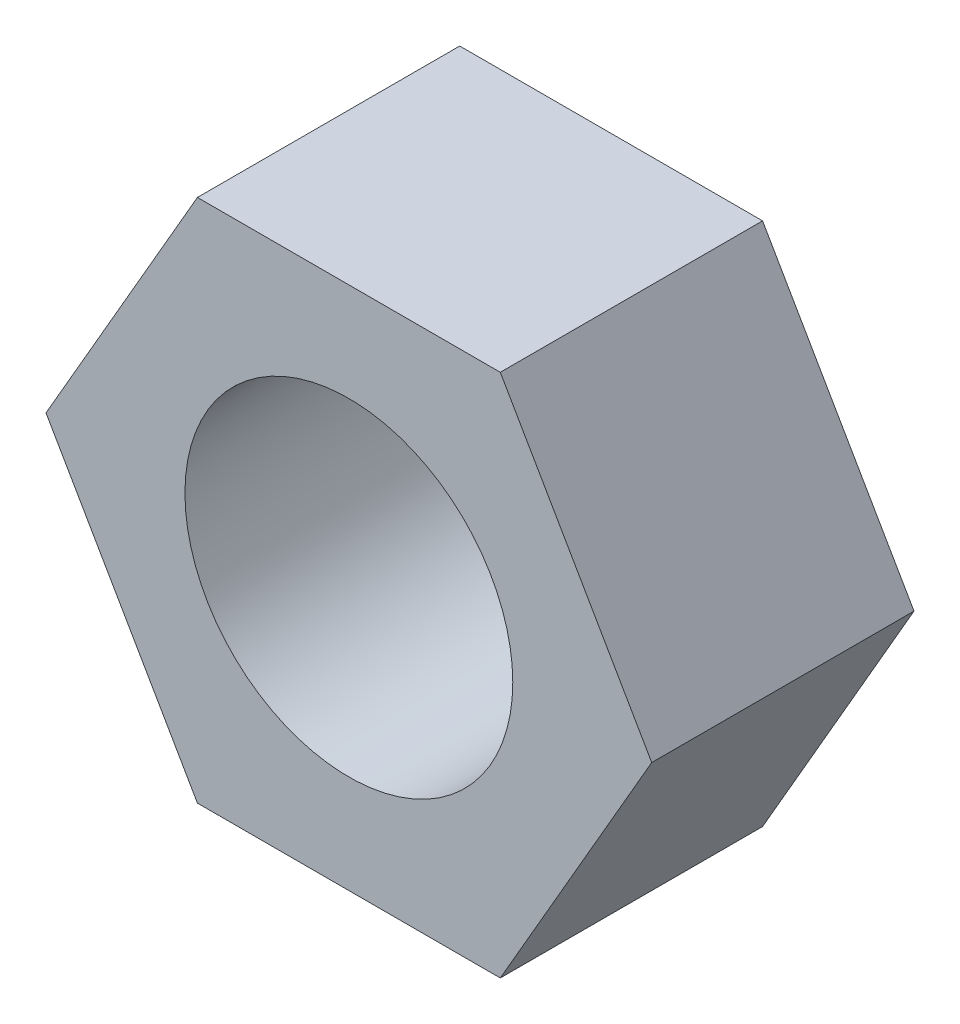
ISO-10303-21;
HEADER;
FILE_DESCRIPTION(('STEP AP214'),'2;1');
FILE_NAME('part.step','',(''),(''),'','','');
FILE_SCHEMA(('AUTOMOTIVE_DESIGN { 1 0 10303 214 1 1 1 1 }'));
ENDSEC;
DATA;
#1=APPLICATION_CONTEXT('core data for automotive mechanical design processes');
#2=APPLICATION_PROTOCOL_DEFINITION('international standard','automotive_design',2000,#1);
#3=PRODUCT_CONTEXT('',#1,'mechanical');
#4=PRODUCT('Part','Part','',(#3));
#5=PRODUCT_RELATED_PRODUCT_CATEGORY('part','',(#4));
#6=PRODUCT_DEFINITION_FORMATION('','',#4);
#7=PRODUCT_DEFINITION_CONTEXT('part definition',#1,'design');
#8=PRODUCT_DEFINITION('design','',#6,#7);
#9=PRODUCT_DEFINITION_SHAPE('','',#8);
#10=(LENGTH_UNIT() NAMED_UNIT(*) SI_UNIT(.MILLI.,.METRE.));
#11=(NAMED_UNIT(*) PLANE_ANGLE_UNIT() SI_UNIT($,.RADIAN.));
#12=(NAMED_UNIT(*) SI_UNIT($,.STERADIAN.) SOLID_ANGLE_UNIT());
#13=UNCERTAINTY_MEASURE_WITH_UNIT(LENGTH_MEASURE(1.E-05),#10,'distance_accuracy_value','');
#14=(GEOMETRIC_REPRESENTATION_CONTEXT(3) GLOBAL_UNCERTAINTY_ASSIGNED_CONTEXT((#13)) GLOBAL_UNIT_ASSIGNED_CONTEXT((#10,
#11,#12)) REPRESENTATION_CONTEXT('',''));
#15=CARTESIAN_POINT('',(0.,0.,0.));
#16=DIRECTION('',(0.,0.,1.));
#17=DIRECTION('',(1.,0.,0.));
#18=AXIS2_PLACEMENT_3D('',#15,#16,#17);
#19=CARTESIAN_POINT('',(0.,0.,4.));
#20=DIRECTION('',(0.,0.,1.));
#21=DIRECTION('',(1.,0.,0.));
#22=AXIS2_PLACEMENT_3D('',#19,#20,#21);
#23=PLANE('',#22);
#24=DIRECTION('',(0.5,0.866025403784439,0.));
#25=VECTOR('',#24,1.);
#26=CARTESIAN_POINT('',(2.3094010767585,-4.,4.));
#27=LINE('',#26,#25);
#28=CARTESIAN_POINT('',(2.3094010767585,-4.,4.));
#29=VERTEX_POINT('',#28);
#30=CARTESIAN_POINT('',(4.61880215351701,0.,4.));
#31=VERTEX_POINT('',#30);
#32=EDGE_CURVE('E130',#29,#31,#27,.T.);
#33=ORIENTED_EDGE('',*,*,#32,.T.);
#34=DIRECTION('',(-0.5,0.866025403784438,0.));
#35=VECTOR('',#34,1.);
#36=CARTESIAN_POINT('',(4.61880215351701,0.,4.));
#37=LINE('',#36,#35);
#38=CARTESIAN_POINT('',(2.3094010767585,4.00000000000001,4.));
#39=VERTEX_POINT('',#38);
#40=EDGE_CURVE('E88',#31,#39,#37,.T.);
#41=ORIENTED_EDGE('',*,*,#40,.T.);
#42=DIRECTION('',(-1.,0.,0.));
#43=VECTOR('',#42,1.);
#44=CARTESIAN_POINT('',(2.3094010767585,4.00000000000001,4.));
#45=LINE('',#44,#43);
#46=CARTESIAN_POINT('',(-2.30940107675851,4.00000000000001,4.));
#47=VERTEX_POINT('',#46);
#48=EDGE_CURVE('E101',#39,#47,#45,.T.);
#49=ORIENTED_EDGE('',*,*,#48,.T.);
#50=DIRECTION('',(-0.5,-0.866025403784439,0.));
#51=VECTOR('',#50,1.);
#52=CARTESIAN_POINT('',(-2.30940107675851,4.00000000000001,4.));
#53=LINE('',#52,#51);
#54=CARTESIAN_POINT('',(-4.61880215351701,0.,4.));
#55=VERTEX_POINT('',#54);
#56=EDGE_CURVE('E95',#47,#55,#53,.T.);
#57=ORIENTED_EDGE('',*,*,#56,.T.);
#58=DIRECTION('',(0.5,-0.866025403784439,0.));
#59=VECTOR('',#58,1.);
#60=CARTESIAN_POINT('',(-4.61880215351701,0.,4.));
#61=LINE('',#60,#59);
#62=CARTESIAN_POINT('',(-2.30940107675851,-4.,4.));
#63=VERTEX_POINT('',#62);
#64=EDGE_CURVE('E99',#55,#63,#61,.T.);
#65=ORIENTED_EDGE('',*,*,#64,.T.);
#66=DIRECTION('',(1.,0.,0.));
#67=VECTOR('',#66,1.);
#68=CARTESIAN_POINT('',(-2.30940107675851,-4.,4.));
#69=LINE('',#68,#67);
#70=EDGE_CURVE('E51',#63,#29,#69,.T.);
#71=ORIENTED_EDGE('',*,*,#70,.T.);
#72=EDGE_LOOP('',(#33,#41,#49,#57,#65,#71));
#73=FACE_BOUND('',#72,.T.);
#74=CARTESIAN_POINT('',(0.,0.,4.));
#75=DIRECTION('',(0.,0.,1.));
#76=DIRECTION('',(1.,0.,0.));
#77=AXIS2_PLACEMENT_3D('',#74,#75,#76);
#78=CIRCLE('',#77,2.5);
#79=CARTESIAN_POINT('',(2.5,0.,4.));
#80=VERTEX_POINT('',#79);
#81=EDGE_CURVE('E123',#80,#80,#78,.T.);
#82=ORIENTED_EDGE('',*,*,#81,.F.);
#83=EDGE_LOOP('',(#82));
#84=FACE_BOUND('',#83,.T.);
#85=ADVANCED_FACE('F34',(#73,#84),#23,.T.);
#86=CARTESIAN_POINT('',(0.,0.,0.));
#87=DIRECTION('',(0.,0.,1.));
#88=DIRECTION('',(1.,0.,0.));
#89=AXIS2_PLACEMENT_3D('',#86,#87,#88);
#90=PLANE('',#89);
#91=DIRECTION('',(0.5,0.866025403784439,0.));
#92=VECTOR('',#91,1.);
#93=CARTESIAN_POINT('',(2.3094010767585,-4.,0.));
#94=LINE('',#93,#92);
#95=CARTESIAN_POINT('',(2.3094010767585,-4.,0.));
#96=VERTEX_POINT('',#95);
#97=CARTESIAN_POINT('',(4.61880215351701,0.,0.));
#98=VERTEX_POINT('',#97);
#99=EDGE_CURVE('E119',#96,#98,#94,.T.);
#100=ORIENTED_EDGE('',*,*,#99,.F.);
#101=DIRECTION('',(1.,0.,0.));
#102=VECTOR('',#101,1.);
#103=CARTESIAN_POINT('',(-2.30940107675851,-4.,0.));
#104=LINE('',#103,#102);
#105=CARTESIAN_POINT('',(-2.30940107675851,-4.,0.));
#106=VERTEX_POINT('',#105);
#107=EDGE_CURVE('E80',#106,#96,#104,.T.);
#108=ORIENTED_EDGE('',*,*,#107,.F.);
#109=DIRECTION('',(0.5,-0.866025403784439,0.));
#110=VECTOR('',#109,1.);
#111=CARTESIAN_POINT('',(-4.61880215351701,0.,0.));
#112=LINE('',#111,#110);
#113=CARTESIAN_POINT('',(-4.61880215351701,0.,0.));
#114=VERTEX_POINT('',#113);
#115=EDGE_CURVE('E74',#114,#106,#112,.T.);
#116=ORIENTED_EDGE('',*,*,#115,.F.);
#117=DIRECTION('',(-0.5,-0.866025403784439,0.));
#118=VECTOR('',#117,1.);
#119=CARTESIAN_POINT('',(-2.30940107675851,4.00000000000001,0.));
#120=LINE('',#119,#118);
#121=CARTESIAN_POINT('',(-2.30940107675851,4.00000000000001,0.));
#122=VERTEX_POINT('',#121);
#123=EDGE_CURVE('E109',#122,#114,#120,.T.);
#124=ORIENTED_EDGE('',*,*,#123,.F.);
#125=DIRECTION('',(-1.,0.,0.));
#126=VECTOR('',#125,1.);
#127=CARTESIAN_POINT('',(2.3094010767585,4.00000000000001,0.));
#128=LINE('',#127,#126);
#129=CARTESIAN_POINT('',(2.3094010767585,4.00000000000001,0.));
#130=VERTEX_POINT('',#129);
#131=EDGE_CURVE('E125',#130,#122,#128,.T.);
#132=ORIENTED_EDGE('',*,*,#131,.F.);
#133=DIRECTION('',(-0.5,0.866025403784438,0.));
#134=VECTOR('',#133,1.);
#135=CARTESIAN_POINT('',(4.61880215351701,0.,0.));
#136=LINE('',#135,#134);
#137=EDGE_CURVE('E122',#98,#130,#136,.T.);
#138=ORIENTED_EDGE('',*,*,#137,.F.);
#139=EDGE_LOOP('',(#100,#108,#116,#124,#132,#138));
#140=FACE_BOUND('',#139,.T.);
#141=CARTESIAN_POINT('',(0.,0.,0.));
#142=DIRECTION('',(0.,0.,1.));
#143=DIRECTION('',(1.,0.,0.));
#144=AXIS2_PLACEMENT_3D('',#141,#142,#143);
#145=CIRCLE('',#144,2.5);
#146=CARTESIAN_POINT('',(2.5,0.,0.));
#147=VERTEX_POINT('',#146);
#148=EDGE_CURVE('E223',#147,#147,#145,.T.);
#149=ORIENTED_EDGE('',*,*,#148,.T.);
#150=EDGE_LOOP('',(#149));
#151=FACE_BOUND('',#150,.T.);
#152=ADVANCED_FACE('F139',(#140,#151),#90,.F.);
#153=CARTESIAN_POINT('',(2.3094010767585,-4.,4.));
#154=DIRECTION('',(-0.866025403784439,0.5,0.));
#155=DIRECTION('',(-0.5,-0.866025403784439,0.));
#156=AXIS2_PLACEMENT_3D('',#153,#154,#155);
#157=PLANE('',#156);
#158=ORIENTED_EDGE('',*,*,#99,.T.);
#159=DIRECTION('',(0.,0.,-1.));
#160=VECTOR('',#159,1.);
#161=CARTESIAN_POINT('',(4.61880215351701,0.,4.));
#162=LINE('',#161,#160);
#163=EDGE_CURVE('E11',#31,#98,#162,.T.);
#164=ORIENTED_EDGE('',*,*,#163,.F.);
#165=ORIENTED_EDGE('',*,*,#32,.F.);
#166=DIRECTION('',(0.,0.,-1.));
#167=VECTOR('',#166,1.);
#168=CARTESIAN_POINT('',(2.3094010767585,-4.,4.));
#169=LINE('',#168,#167);
#170=EDGE_CURVE('E115',#29,#96,#169,.T.);
#171=ORIENTED_EDGE('',*,*,#170,.T.);
#172=EDGE_LOOP('',(#158,#164,#165,#171));
#173=FACE_BOUND('',#172,.T.);
#174=ADVANCED_FACE('F36',(#173),#157,.F.);
#175=CARTESIAN_POINT('',(4.61880215351701,0.,4.));
#176=DIRECTION('',(-0.866025403784439,-0.5,0.));
#177=DIRECTION('',(0.5,-0.866025403784439,0.));
#178=AXIS2_PLACEMENT_3D('',#175,#176,#177);
#179=PLANE('',#178);
#180=ORIENTED_EDGE('',*,*,#137,.T.);
#181=DIRECTION('',(0.,0.,-1.));
#182=VECTOR('',#181,1.);
#183=CARTESIAN_POINT('',(2.3094010767585,4.00000000000001,4.));
#184=LINE('',#183,#182);
#185=EDGE_CURVE('E43',#39,#130,#184,.T.);
#186=ORIENTED_EDGE('',*,*,#185,.F.);
#187=ORIENTED_EDGE('',*,*,#40,.F.);
#188=ORIENTED_EDGE('',*,*,#163,.T.);
#189=EDGE_LOOP('',(#180,#186,#187,#188));
#190=FACE_BOUND('',#189,.T.);
#191=ADVANCED_FACE('F164',(#190),#179,.F.);
#192=CARTESIAN_POINT('',(2.3094010767585,4.00000000000001,4.));
#193=DIRECTION('',(0.,-1.,0.));
#194=DIRECTION('',(0.,0.,-1.));
#195=AXIS2_PLACEMENT_3D('',#192,#193,#194);
#196=PLANE('',#195);
#197=ORIENTED_EDGE('',*,*,#131,.T.);
#198=DIRECTION('',(0.,0.,-1.));
#199=VECTOR('',#198,1.);
#200=CARTESIAN_POINT('',(-2.30940107675851,4.00000000000001,4.));
#201=LINE('',#200,#199);
#202=EDGE_CURVE('E110',#47,#122,#201,.T.);
#203=ORIENTED_EDGE('',*,*,#202,.F.);
#204=ORIENTED_EDGE('',*,*,#48,.F.);
#205=ORIENTED_EDGE('',*,*,#185,.T.);
#206=EDGE_LOOP('',(#197,#203,#204,#205));
#207=FACE_BOUND('',#206,.T.);
#208=ADVANCED_FACE('F136',(#207),#196,.F.);
#209=CARTESIAN_POINT('',(-2.30940107675851,4.00000000000001,4.));
#210=DIRECTION('',(0.866025403784439,-0.5,0.));
#211=DIRECTION('',(0.5,0.866025403784439,0.));
#212=AXIS2_PLACEMENT_3D('',#209,#210,#211);
#213=PLANE('',#212);
#214=ORIENTED_EDGE('',*,*,#123,.T.);
#215=DIRECTION('',(0.,0.,-1.));
#216=VECTOR('',#215,1.);
#217=CARTESIAN_POINT('',(-4.61880215351701,0.,4.));
#218=LINE('',#217,#216);
#219=EDGE_CURVE('E106',#55,#114,#218,.T.);
#220=ORIENTED_EDGE('',*,*,#219,.F.);
#221=ORIENTED_EDGE('',*,*,#56,.F.);
#222=ORIENTED_EDGE('',*,*,#202,.T.);
#223=EDGE_LOOP('',(#214,#220,#221,#222));
#224=FACE_BOUND('',#223,.T.);
#225=ADVANCED_FACE('F107',(#224),#213,.F.);
#226=CARTESIAN_POINT('',(-4.61880215351701,0.,4.));
#227=DIRECTION('',(0.866025403784439,0.5,0.));
#228=DIRECTION('',(-0.5,0.866025403784439,0.));
#229=AXIS2_PLACEMENT_3D('',#226,#227,#228);
#230=PLANE('',#229);
#231=ORIENTED_EDGE('',*,*,#115,.T.);
#232=DIRECTION('',(0.,0.,-1.));
#233=VECTOR('',#232,1.);
#234=CARTESIAN_POINT('',(-2.30940107675851,-4.,4.));
#235=LINE('',#234,#233);
#236=EDGE_CURVE('E111',#63,#106,#235,.T.);
#237=ORIENTED_EDGE('',*,*,#236,.F.);
#238=ORIENTED_EDGE('',*,*,#64,.F.);
#239=ORIENTED_EDGE('',*,*,#219,.T.);
#240=EDGE_LOOP('',(#231,#237,#238,#239));
#241=FACE_BOUND('',#240,.T.);
#242=ADVANCED_FACE('F113',(#241),#230,.F.);
#243=CARTESIAN_POINT('',(-2.30940107675851,-4.,4.));
#244=DIRECTION('',(0.,1.,0.));
#245=DIRECTION('',(0.,0.,1.));
#246=AXIS2_PLACEMENT_3D('',#243,#244,#245);
#247=PLANE('',#246);
#248=ORIENTED_EDGE('',*,*,#107,.T.);
#249=ORIENTED_EDGE('',*,*,#170,.F.);
#250=ORIENTED_EDGE('',*,*,#70,.F.);
#251=ORIENTED_EDGE('',*,*,#236,.T.);
#252=EDGE_LOOP('',(#248,#249,#250,#251));
#253=FACE_BOUND('',#252,.T.);
#254=ADVANCED_FACE('F144',(#253),#247,.F.);
#255=CARTESIAN_POINT('',(0.,0.,4.));
#256=DIRECTION('',(0.,0.,-1.));
#257=DIRECTION('',(-1.,0.,0.));
#258=AXIS2_PLACEMENT_3D('',#255,#256,#257);
#259=CYLINDRICAL_SURFACE('',#258,2.5);
#260=ORIENTED_EDGE('',*,*,#81,.T.);
#261=EDGE_LOOP('',(#260));
#262=FACE_BOUND('',#261,.T.);
#263=ORIENTED_EDGE('',*,*,#148,.F.);
#264=EDGE_LOOP('',(#263));
#265=FACE_BOUND('',#264,.T.);
#266=ADVANCED_FACE('F146',(#262,#265),#259,.F.);
#267=CLOSED_SHELL('',(#85,#152,#174,#191,#208,#225,#242,#254,#266));
#268=MANIFOLD_SOLID_BREP('B2',#267);
#269=ADVANCED_BREP_SHAPE_REPRESENTATION('',(#18,#268),#14);
#270=SHAPE_DEFINITION_REPRESENTATION(#9,#269);
ENDSEC;
END-ISO-10303-21;
